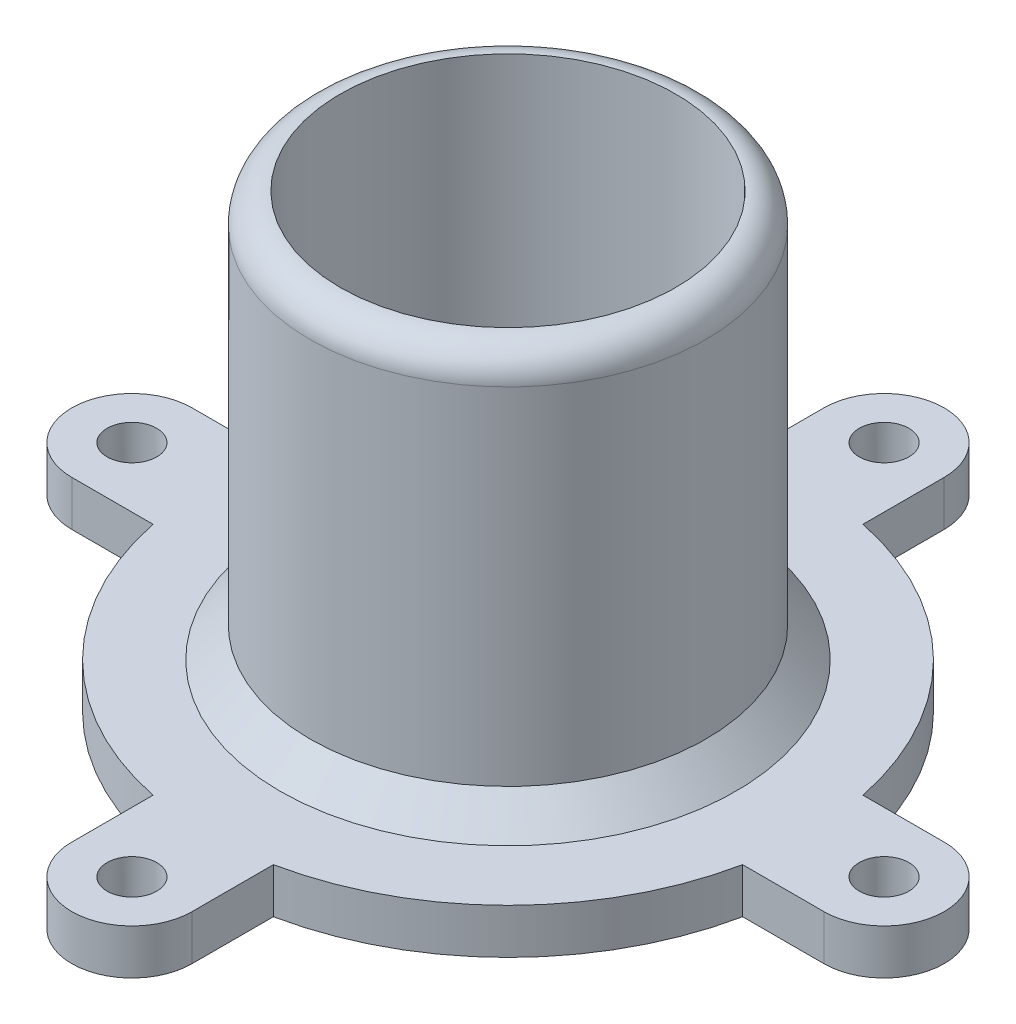
ISO-10303-21;
HEADER;
FILE_DESCRIPTION(('STEP AP214'),'2;1');
FILE_NAME('part.step','',(''),(''),'','','');
FILE_SCHEMA(('AUTOMOTIVE_DESIGN { 1 0 10303 214 1 1 1 1 }'));
ENDSEC;
DATA;
#1=APPLICATION_CONTEXT('core data for automotive mechanical design processes');
#2=APPLICATION_PROTOCOL_DEFINITION('international standard','automotive_design',2000,#1);
#3=PRODUCT_CONTEXT('',#1,'mechanical');
#4=PRODUCT('Part','Part','',(#3));
#5=PRODUCT_RELATED_PRODUCT_CATEGORY('part','',(#4));
#6=PRODUCT_DEFINITION_FORMATION('','',#4);
#7=PRODUCT_DEFINITION_CONTEXT('part definition',#1,'design');
#8=PRODUCT_DEFINITION('design','',#6,#7);
#9=PRODUCT_DEFINITION_SHAPE('','',#8);
#10=(LENGTH_UNIT() NAMED_UNIT(*) SI_UNIT(.MILLI.,.METRE.));
#11=(NAMED_UNIT(*) PLANE_ANGLE_UNIT() SI_UNIT($,.RADIAN.));
#12=(NAMED_UNIT(*) SI_UNIT($,.STERADIAN.) SOLID_ANGLE_UNIT());
#13=UNCERTAINTY_MEASURE_WITH_UNIT(LENGTH_MEASURE(1.E-05),#10,'distance_accuracy_value','');
#14=(GEOMETRIC_REPRESENTATION_CONTEXT(3) GLOBAL_UNCERTAINTY_ASSIGNED_CONTEXT((#13)) GLOBAL_UNIT_ASSIGNED_CONTEXT((#10,
#11,#12)) REPRESENTATION_CONTEXT('',''));
#15=CARTESIAN_POINT('',(0.,0.,0.));
#16=DIRECTION('',(0.,0.,1.));
#17=DIRECTION('',(1.,0.,0.));
#18=AXIS2_PLACEMENT_3D('',#15,#16,#17);
#19=CARTESIAN_POINT('',(0.,3.,0.));
#20=DIRECTION('',(0.,-1.,0.));
#21=DIRECTION('',(0.,0.,-1.));
#22=AXIS2_PLACEMENT_3D('',#19,#20,#21);
#23=CYLINDRICAL_SURFACE('',#22,20.);
#24=DIRECTION('',(0.,1.,0.));
#25=VECTOR('',#24,1.);
#26=CARTESIAN_POINT('',(4.00000000000021,-12.346528230584,19.5959179422654));
#27=LINE('',#26,#25);
#28=CARTESIAN_POINT('',(4.00000000000021,0.,19.5959179422654));
#29=VERTEX_POINT('',#28);
#30=CARTESIAN_POINT('',(4.00000000000021,3.,19.5959179422654));
#31=VERTEX_POINT('',#30);
#32=EDGE_CURVE('E164',#29,#31,#27,.T.);
#33=ORIENTED_EDGE('',*,*,#32,.F.);
#34=CARTESIAN_POINT('',(0.,0.,0.));
#35=DIRECTION('',(0.,1.,0.));
#36=DIRECTION('',(0.,0.,1.));
#37=AXIS2_PLACEMENT_3D('',#34,#35,#36);
#38=CIRCLE('',#37,20.);
#39=CARTESIAN_POINT('',(19.5959179422654,0.,4.));
#40=VERTEX_POINT('',#39);
#41=EDGE_CURVE('E151',#29,#40,#38,.T.);
#42=ORIENTED_EDGE('',*,*,#41,.T.);
#43=DIRECTION('',(0.,1.,0.));
#44=VECTOR('',#43,1.);
#45=CARTESIAN_POINT('',(19.5959179422654,-12.3465282305839,4.));
#46=LINE('',#45,#44);
#47=CARTESIAN_POINT('',(19.5959179422654,3.,4.));
#48=VERTEX_POINT('',#47);
#49=EDGE_CURVE('E265',#40,#48,#46,.T.);
#50=ORIENTED_EDGE('',*,*,#49,.T.);
#51=CARTESIAN_POINT('',(0.,3.,0.));
#52=DIRECTION('',(0.,1.,0.));
#53=DIRECTION('',(0.,0.,1.));
#54=AXIS2_PLACEMENT_3D('',#51,#52,#53);
#55=CIRCLE('',#54,20.);
#56=EDGE_CURVE('E53',#31,#48,#55,.T.);
#57=ORIENTED_EDGE('',*,*,#56,.F.);
#58=EDGE_LOOP('',(#33,#42,#50,#57));
#59=FACE_BOUND('',#58,.T.);
#60=ADVANCED_FACE('F38',(#59),#23,.T.);
#61=CARTESIAN_POINT('',(-19.5959179422654,0.,4.));
#62=VERTEX_POINT('',#61);
#63=CARTESIAN_POINT('',(-3.99999999999979,0.,19.5959179422655));
#64=VERTEX_POINT('',#63);
#65=EDGE_CURVE('E160',#62,#64,#38,.T.);
#66=ORIENTED_EDGE('',*,*,#65,.T.);
#67=DIRECTION('',(0.,1.,0.));
#68=VECTOR('',#67,1.);
#69=CARTESIAN_POINT('',(-3.99999999999979,-12.346528230584,19.5959179422655));
#70=LINE('',#69,#68);
#71=CARTESIAN_POINT('',(-3.99999999999979,3.,19.5959179422655));
#72=VERTEX_POINT('',#71);
#73=EDGE_CURVE('E61',#64,#72,#70,.T.);
#74=ORIENTED_EDGE('',*,*,#73,.T.);
#75=CARTESIAN_POINT('',(-19.5959179422654,3.,4.));
#76=VERTEX_POINT('',#75);
#77=EDGE_CURVE('E356',#76,#72,#55,.T.);
#78=ORIENTED_EDGE('',*,*,#77,.F.);
#79=DIRECTION('',(0.,1.,0.));
#80=VECTOR('',#79,1.);
#81=CARTESIAN_POINT('',(-19.5959179422654,-12.3465282305839,4.));
#82=LINE('',#81,#80);
#83=EDGE_CURVE('E184',#62,#76,#82,.T.);
#84=ORIENTED_EDGE('',*,*,#83,.F.);
#85=EDGE_LOOP('',(#66,#74,#78,#84));
#86=FACE_BOUND('',#85,.T.);
#87=ADVANCED_FACE('F318',(#86),#23,.T.);
#88=CARTESIAN_POINT('',(-4.00000000000007,0.,-19.5959179422654));
#89=VERTEX_POINT('',#88);
#90=CARTESIAN_POINT('',(-19.5959179422654,0.,-4.));
#91=VERTEX_POINT('',#90);
#92=EDGE_CURVE('E282',#89,#91,#38,.T.);
#93=ORIENTED_EDGE('',*,*,#92,.T.);
#94=DIRECTION('',(0.,1.,0.));
#95=VECTOR('',#94,1.);
#96=CARTESIAN_POINT('',(-19.5959179422654,-12.3465282305839,-4.));
#97=LINE('',#96,#95);
#98=CARTESIAN_POINT('',(-19.5959179422654,3.,-4.));
#99=VERTEX_POINT('',#98);
#100=EDGE_CURVE('E201',#91,#99,#97,.T.);
#101=ORIENTED_EDGE('',*,*,#100,.T.);
#102=CARTESIAN_POINT('',(-4.00000000000007,3.,-19.5959179422654));
#103=VERTEX_POINT('',#102);
#104=EDGE_CURVE('E280',#103,#99,#55,.T.);
#105=ORIENTED_EDGE('',*,*,#104,.F.);
#106=DIRECTION('',(0.,1.,0.));
#107=VECTOR('',#106,1.);
#108=CARTESIAN_POINT('',(-4.00000000000007,-12.3465282305839,-19.5959179422654));
#109=LINE('',#108,#107);
#110=EDGE_CURVE('E218',#89,#103,#109,.T.);
#111=ORIENTED_EDGE('',*,*,#110,.F.);
#112=EDGE_LOOP('',(#93,#101,#105,#111));
#113=FACE_BOUND('',#112,.T.);
#114=ADVANCED_FACE('F324',(#113),#23,.T.);
#115=CARTESIAN_POINT('',(19.5959179422654,0.,-4.));
#116=VERTEX_POINT('',#115);
#117=CARTESIAN_POINT('',(3.99999999999993,0.,-19.5959179422654));
#118=VERTEX_POINT('',#117);
#119=EDGE_CURVE('E163',#116,#118,#38,.T.);
#120=ORIENTED_EDGE('',*,*,#119,.T.);
#121=DIRECTION('',(0.,1.,0.));
#122=VECTOR('',#121,1.);
#123=CARTESIAN_POINT('',(3.99999999999993,-12.3465282305839,-19.5959179422654));
#124=LINE('',#123,#122);
#125=CARTESIAN_POINT('',(3.99999999999993,3.,-19.5959179422654));
#126=VERTEX_POINT('',#125);
#127=EDGE_CURVE('E235',#118,#126,#124,.T.);
#128=ORIENTED_EDGE('',*,*,#127,.T.);
#129=CARTESIAN_POINT('',(19.5959179422654,3.,-4.));
#130=VERTEX_POINT('',#129);
#131=EDGE_CURVE('E277',#130,#126,#55,.T.);
#132=ORIENTED_EDGE('',*,*,#131,.F.);
#133=DIRECTION('',(0.,1.,0.));
#134=VECTOR('',#133,1.);
#135=CARTESIAN_POINT('',(19.5959179422654,-12.3465282305839,-4.));
#136=LINE('',#135,#134);
#137=EDGE_CURVE('E250',#116,#130,#136,.T.);
#138=ORIENTED_EDGE('',*,*,#137,.F.);
#139=EDGE_LOOP('',(#120,#128,#132,#138));
#140=FACE_BOUND('',#139,.T.);
#141=ADVANCED_FACE('F320',(#140),#23,.T.);
#142=CARTESIAN_POINT('',(0.,3.,0.));
#143=DIRECTION('',(0.,1.,0.));
#144=DIRECTION('',(0.,0.,1.));
#145=AXIS2_PLACEMENT_3D('',#142,#143,#144);
#146=PLANE('',#145);
#147=CARTESIAN_POINT('',(0.,3.,0.));
#148=DIRECTION('',(0.,1.,0.));
#149=DIRECTION('',(0.,0.,1.));
#150=AXIS2_PLACEMENT_3D('',#147,#148,#149);
#151=CIRCLE('',#150,15.15);
#152=CARTESIAN_POINT('',(0.,3.,15.15));
#153=VERTEX_POINT('',#152);
#154=EDGE_CURVE('E46',#153,#153,#151,.F.);
#155=ORIENTED_EDGE('',*,*,#154,.T.);
#156=EDGE_LOOP('',(#155));
#157=FACE_BOUND('',#156,.T.);
#158=ORIENTED_EDGE('',*,*,#131,.T.);
#159=DIRECTION('',(0.,0.,-1.));
#160=VECTOR('',#159,1.);
#161=CARTESIAN_POINT('',(4.,3.,0.));
#162=LINE('',#161,#160);
#163=CARTESIAN_POINT('',(3.99999999999991,3.,-25.));
#164=VERTEX_POINT('',#163);
#165=EDGE_CURVE('E223',#126,#164,#162,.T.);
#166=ORIENTED_EDGE('',*,*,#165,.T.);
#167=CARTESIAN_POINT('',(0.,3.,-25.));
#168=DIRECTION('',(0.,1.,0.));
#169=DIRECTION('',(1.,0.,0.));
#170=AXIS2_PLACEMENT_3D('',#167,#168,#169);
#171=CIRCLE('',#170,4.);
#172=CARTESIAN_POINT('',(-4.00000000000009,3.,-25.));
#173=VERTEX_POINT('',#172);
#174=EDGE_CURVE('E219',#164,#173,#171,.T.);
#175=ORIENTED_EDGE('',*,*,#174,.T.);
#176=DIRECTION('',(0.,0.,-1.));
#177=VECTOR('',#176,1.);
#178=CARTESIAN_POINT('',(-4.,3.,0.));
#179=LINE('',#178,#177);
#180=EDGE_CURVE('E214',#103,#173,#179,.T.);
#181=ORIENTED_EDGE('',*,*,#180,.F.);
#182=ORIENTED_EDGE('',*,*,#104,.T.);
#183=DIRECTION('',(-1.,0.,0.));
#184=VECTOR('',#183,1.);
#185=CARTESIAN_POINT('',(0.,3.,-4.));
#186=LINE('',#185,#184);
#187=CARTESIAN_POINT('',(-25.,3.,-4.));
#188=VERTEX_POINT('',#187);
#189=EDGE_CURVE('E189',#99,#188,#186,.T.);
#190=ORIENTED_EDGE('',*,*,#189,.T.);
#191=CARTESIAN_POINT('',(-25.,3.,0.));
#192=DIRECTION('',(0.,1.,0.));
#193=DIRECTION('',(0.,0.,-1.));
#194=AXIS2_PLACEMENT_3D('',#191,#192,#193);
#195=CIRCLE('',#194,4.);
#196=CARTESIAN_POINT('',(-25.,3.,4.));
#197=VERTEX_POINT('',#196);
#198=EDGE_CURVE('E185',#188,#197,#195,.T.);
#199=ORIENTED_EDGE('',*,*,#198,.T.);
#200=DIRECTION('',(-1.,0.,0.));
#201=VECTOR('',#200,1.);
#202=CARTESIAN_POINT('',(0.,3.,4.));
#203=LINE('',#202,#201);
#204=EDGE_CURVE('E180',#76,#197,#203,.T.);
#205=ORIENTED_EDGE('',*,*,#204,.F.);
#206=ORIENTED_EDGE('',*,*,#77,.T.);
#207=DIRECTION('',(0.,0.,1.));
#208=VECTOR('',#207,1.);
#209=CARTESIAN_POINT('',(-4.,3.,0.));
#210=LINE('',#209,#208);
#211=CARTESIAN_POINT('',(-3.99999999999974,3.,25.));
#212=VERTEX_POINT('',#211);
#213=EDGE_CURVE('E382',#72,#212,#210,.T.);
#214=ORIENTED_EDGE('',*,*,#213,.T.);
#215=CARTESIAN_POINT('',(2.61861100413235E-13,3.,25.));
#216=DIRECTION('',(0.,1.,0.));
#217=DIRECTION('',(-1.,0.,0.));
#218=AXIS2_PLACEMENT_3D('',#215,#216,#217);
#219=CIRCLE('',#218,4.);
#220=CARTESIAN_POINT('',(4.00000000000026,3.,25.));
#221=VERTEX_POINT('',#220);
#222=EDGE_CURVE('E380',#212,#221,#219,.T.);
#223=ORIENTED_EDGE('',*,*,#222,.T.);
#224=DIRECTION('',(0.,0.,1.));
#225=VECTOR('',#224,1.);
#226=CARTESIAN_POINT('',(4.,3.,0.));
#227=LINE('',#226,#225);
#228=EDGE_CURVE('E168',#31,#221,#227,.T.);
#229=ORIENTED_EDGE('',*,*,#228,.F.);
#230=ORIENTED_EDGE('',*,*,#56,.T.);
#231=DIRECTION('',(1.,0.,0.));
#232=VECTOR('',#231,1.);
#233=CARTESIAN_POINT('',(0.,3.,4.));
#234=LINE('',#233,#232);
#235=CARTESIAN_POINT('',(25.,3.,4.));
#236=VERTEX_POINT('',#235);
#237=EDGE_CURVE('E254',#48,#236,#234,.T.);
#238=ORIENTED_EDGE('',*,*,#237,.T.);
#239=CARTESIAN_POINT('',(25.,3.,0.));
#240=DIRECTION('',(0.,1.,0.));
#241=DIRECTION('',(0.,0.,1.));
#242=AXIS2_PLACEMENT_3D('',#239,#240,#241);
#243=CIRCLE('',#242,4.);
#244=CARTESIAN_POINT('',(25.,3.,-4.));
#245=VERTEX_POINT('',#244);
#246=EDGE_CURVE('E251',#236,#245,#243,.T.);
#247=ORIENTED_EDGE('',*,*,#246,.T.);
#248=DIRECTION('',(1.,0.,0.));
#249=VECTOR('',#248,1.);
#250=CARTESIAN_POINT('',(0.,3.,-4.));
#251=LINE('',#250,#249);
#252=EDGE_CURVE('E246',#130,#245,#251,.T.);
#253=ORIENTED_EDGE('',*,*,#252,.F.);
#254=EDGE_LOOP('',(#158,#166,#175,#181,#182,#190,#199,#205,#206,#214,#223,#229,#230,#238,#247,#253));
#255=FACE_BOUND('',#254,.T.);
#256=CARTESIAN_POINT('',(25.,3.,0.));
#257=DIRECTION('',(0.,1.,0.));
#258=DIRECTION('',(0.,0.,1.));
#259=AXIS2_PLACEMENT_3D('',#256,#257,#258);
#260=CIRCLE('',#259,1.65);
#261=CARTESIAN_POINT('',(25.,3.,1.65));
#262=VERTEX_POINT('',#261);
#263=EDGE_CURVE('E258',#262,#262,#260,.T.);
#264=ORIENTED_EDGE('',*,*,#263,.F.);
#265=EDGE_LOOP('',(#264));
#266=FACE_BOUND('',#265,.T.);
#267=CARTESIAN_POINT('',(0.,3.,-25.));
#268=DIRECTION('',(0.,1.,0.));
#269=DIRECTION('',(1.,0.,0.));
#270=AXIS2_PLACEMENT_3D('',#267,#268,#269);
#271=CIRCLE('',#270,1.65);
#272=CARTESIAN_POINT('',(1.64999999999991,3.,-25.));
#273=VERTEX_POINT('',#272);
#274=EDGE_CURVE('E227',#273,#273,#271,.T.);
#275=ORIENTED_EDGE('',*,*,#274,.F.);
#276=EDGE_LOOP('',(#275));
#277=FACE_BOUND('',#276,.T.);
#278=CARTESIAN_POINT('',(-25.,3.,0.));
#279=DIRECTION('',(0.,1.,0.));
#280=DIRECTION('',(0.,0.,-1.));
#281=AXIS2_PLACEMENT_3D('',#278,#279,#280);
#282=CIRCLE('',#281,1.65);
#283=CARTESIAN_POINT('',(-25.,3.,-1.65));
#284=VERTEX_POINT('',#283);
#285=EDGE_CURVE('E193',#284,#284,#282,.T.);
#286=ORIENTED_EDGE('',*,*,#285,.F.);
#287=EDGE_LOOP('',(#286));
#288=FACE_BOUND('',#287,.T.);
#289=CARTESIAN_POINT('',(2.61861100413235E-13,3.,25.));
#290=DIRECTION('',(0.,1.,0.));
#291=DIRECTION('',(-1.,0.,0.));
#292=AXIS2_PLACEMENT_3D('',#289,#290,#291);
#293=CIRCLE('',#292,1.65);
#294=CARTESIAN_POINT('',(-1.64999999999974,3.,25.));
#295=VERTEX_POINT('',#294);
#296=EDGE_CURVE('E386',#295,#295,#293,.T.);
#297=ORIENTED_EDGE('',*,*,#296,.F.);
#298=EDGE_LOOP('',(#297));
#299=FACE_BOUND('',#298,.T.);
#300=ADVANCED_FACE('F293',(#157,#255,#266,#277,#288,#299),#146,.T.);
#301=CARTESIAN_POINT('',(0.,0.,0.));
#302=DIRECTION('',(0.,1.,0.));
#303=DIRECTION('',(0.,0.,1.));
#304=AXIS2_PLACEMENT_3D('',#301,#302,#303);
#305=PLANE('',#304);
#306=CARTESIAN_POINT('',(0.,0.,0.));
#307=DIRECTION('',(0.,1.,0.));
#308=DIRECTION('',(0.,0.,1.));
#309=AXIS2_PLACEMENT_3D('',#306,#307,#308);
#310=CIRCLE('',#309,13.15);
#311=CARTESIAN_POINT('',(0.,0.,13.15));
#312=VERTEX_POINT('',#311);
#313=EDGE_CURVE('E279',#312,#312,#310,.T.);
#314=ORIENTED_EDGE('',*,*,#313,.T.);
#315=EDGE_LOOP('',(#314));
#316=FACE_BOUND('',#315,.T.);
#317=ORIENTED_EDGE('',*,*,#119,.F.);
#318=DIRECTION('',(-1.,0.,0.));
#319=VECTOR('',#318,1.);
#320=CARTESIAN_POINT('',(0.,0.,-4.));
#321=LINE('',#320,#319);
#322=CARTESIAN_POINT('',(25.,0.,-4.));
#323=VERTEX_POINT('',#322);
#324=EDGE_CURVE('E267',#323,#116,#321,.T.);
#325=ORIENTED_EDGE('',*,*,#324,.F.);
#326=CARTESIAN_POINT('',(25.,0.,0.));
#327=DIRECTION('',(0.,1.,0.));
#328=DIRECTION('',(0.,0.,1.));
#329=AXIS2_PLACEMENT_3D('',#326,#327,#328);
#330=CIRCLE('',#329,4.);
#331=CARTESIAN_POINT('',(25.,0.,4.));
#332=VERTEX_POINT('',#331);
#333=EDGE_CURVE('E263',#323,#332,#330,.F.);
#334=ORIENTED_EDGE('',*,*,#333,.T.);
#335=DIRECTION('',(-1.,0.,0.));
#336=VECTOR('',#335,1.);
#337=CARTESIAN_POINT('',(0.,0.,4.));
#338=LINE('',#337,#336);
#339=EDGE_CURVE('E158',#332,#40,#338,.T.);
#340=ORIENTED_EDGE('',*,*,#339,.T.);
#341=ORIENTED_EDGE('',*,*,#41,.F.);
#342=DIRECTION('',(0.,0.,-1.));
#343=VECTOR('',#342,1.);
#344=CARTESIAN_POINT('',(4.,0.,0.));
#345=LINE('',#344,#343);
#346=CARTESIAN_POINT('',(4.00000000000026,0.,25.));
#347=VERTEX_POINT('',#346);
#348=EDGE_CURVE('E155',#347,#29,#345,.T.);
#349=ORIENTED_EDGE('',*,*,#348,.F.);
#350=CARTESIAN_POINT('',(2.61861100413235E-13,0.,25.));
#351=DIRECTION('',(0.,1.,0.));
#352=DIRECTION('',(0.,0.,1.));
#353=AXIS2_PLACEMENT_3D('',#350,#351,#352);
#354=CIRCLE('',#353,4.);
#355=CARTESIAN_POINT('',(-3.99999999999974,0.,25.));
#356=VERTEX_POINT('',#355);
#357=EDGE_CURVE('E209',#347,#356,#354,.F.);
#358=ORIENTED_EDGE('',*,*,#357,.T.);
#359=DIRECTION('',(0.,0.,-1.));
#360=VECTOR('',#359,1.);
#361=CARTESIAN_POINT('',(-4.,0.,0.));
#362=LINE('',#361,#360);
#363=EDGE_CURVE('E178',#356,#64,#362,.T.);
#364=ORIENTED_EDGE('',*,*,#363,.T.);
#365=ORIENTED_EDGE('',*,*,#65,.F.);
#366=DIRECTION('',(1.,0.,0.));
#367=VECTOR('',#366,1.);
#368=CARTESIAN_POINT('',(0.,0.,4.));
#369=LINE('',#368,#367);
#370=CARTESIAN_POINT('',(-25.,0.,4.));
#371=VERTEX_POINT('',#370);
#372=EDGE_CURVE('E203',#371,#62,#369,.T.);
#373=ORIENTED_EDGE('',*,*,#372,.F.);
#374=CARTESIAN_POINT('',(-25.,0.,0.));
#375=DIRECTION('',(0.,1.,0.));
#376=DIRECTION('',(0.,0.,1.));
#377=AXIS2_PLACEMENT_3D('',#374,#375,#376);
#378=CIRCLE('',#377,4.);
#379=CARTESIAN_POINT('',(-25.,0.,-4.));
#380=VERTEX_POINT('',#379);
#381=EDGE_CURVE('E198',#371,#380,#378,.F.);
#382=ORIENTED_EDGE('',*,*,#381,.T.);
#383=DIRECTION('',(1.,0.,0.));
#384=VECTOR('',#383,1.);
#385=CARTESIAN_POINT('',(0.,0.,-4.));
#386=LINE('',#385,#384);
#387=EDGE_CURVE('E188',#380,#91,#386,.T.);
#388=ORIENTED_EDGE('',*,*,#387,.T.);
#389=ORIENTED_EDGE('',*,*,#92,.F.);
#390=DIRECTION('',(0.,0.,1.));
#391=VECTOR('',#390,1.);
#392=CARTESIAN_POINT('',(-4.,0.,0.));
#393=LINE('',#392,#391);
#394=CARTESIAN_POINT('',(-4.00000000000009,0.,-25.));
#395=VERTEX_POINT('',#394);
#396=EDGE_CURVE('E237',#395,#89,#393,.T.);
#397=ORIENTED_EDGE('',*,*,#396,.F.);
#398=CARTESIAN_POINT('',(0.,0.,-25.));
#399=DIRECTION('',(0.,1.,0.));
#400=DIRECTION('',(0.,0.,1.));
#401=AXIS2_PLACEMENT_3D('',#398,#399,#400);
#402=CIRCLE('',#401,4.);
#403=CARTESIAN_POINT('',(3.99999999999991,0.,-25.));
#404=VERTEX_POINT('',#403);
#405=EDGE_CURVE('E232',#395,#404,#402,.F.);
#406=ORIENTED_EDGE('',*,*,#405,.T.);
#407=DIRECTION('',(0.,0.,1.));
#408=VECTOR('',#407,1.);
#409=CARTESIAN_POINT('',(4.,0.,0.));
#410=LINE('',#409,#408);
#411=EDGE_CURVE('E222',#404,#118,#410,.T.);
#412=ORIENTED_EDGE('',*,*,#411,.T.);
#413=EDGE_LOOP('',(#317,#325,#334,#340,#341,#349,#358,#364,#365,#373,#382,#388,#389,#397,#406,#412));
#414=FACE_BOUND('',#413,.T.);
#415=CARTESIAN_POINT('',(25.,0.,0.));
#416=DIRECTION('',(0.,1.,0.));
#417=DIRECTION('',(0.,0.,1.));
#418=AXIS2_PLACEMENT_3D('',#415,#416,#417);
#419=CIRCLE('',#418,1.65);
#420=CARTESIAN_POINT('',(25.,0.,1.65));
#421=VERTEX_POINT('',#420);
#422=EDGE_CURVE('E249',#421,#421,#419,.F.);
#423=ORIENTED_EDGE('',*,*,#422,.F.);
#424=EDGE_LOOP('',(#423));
#425=FACE_BOUND('',#424,.T.);
#426=CARTESIAN_POINT('',(0.,0.,-25.));
#427=DIRECTION('',(0.,1.,0.));
#428=DIRECTION('',(0.,0.,1.));
#429=AXIS2_PLACEMENT_3D('',#426,#427,#428);
#430=CIRCLE('',#429,1.65);
#431=CARTESIAN_POINT('',(0.,0.,-23.35));
#432=VERTEX_POINT('',#431);
#433=EDGE_CURVE('E217',#432,#432,#430,.F.);
#434=ORIENTED_EDGE('',*,*,#433,.F.);
#435=EDGE_LOOP('',(#434));
#436=FACE_BOUND('',#435,.T.);
#437=CARTESIAN_POINT('',(-25.,0.,0.));
#438=DIRECTION('',(0.,1.,0.));
#439=DIRECTION('',(0.,0.,1.));
#440=AXIS2_PLACEMENT_3D('',#437,#438,#439);
#441=CIRCLE('',#440,1.65);
#442=CARTESIAN_POINT('',(-25.,0.,1.65));
#443=VERTEX_POINT('',#442);
#444=EDGE_CURVE('E183',#443,#443,#441,.F.);
#445=ORIENTED_EDGE('',*,*,#444,.F.);
#446=EDGE_LOOP('',(#445));
#447=FACE_BOUND('',#446,.T.);
#448=CARTESIAN_POINT('',(2.61861100413235E-13,0.,25.));
#449=DIRECTION('',(0.,1.,0.));
#450=DIRECTION('',(0.,0.,1.));
#451=AXIS2_PLACEMENT_3D('',#448,#449,#450);
#452=CIRCLE('',#451,1.65);
#453=CARTESIAN_POINT('',(2.61861100413235E-13,0.,26.65));
#454=VERTEX_POINT('',#453);
#455=EDGE_CURVE('E392',#454,#454,#452,.F.);
#456=ORIENTED_EDGE('',*,*,#455,.F.);
#457=EDGE_LOOP('',(#456));
#458=FACE_BOUND('',#457,.T.);
#459=ADVANCED_FACE('F152',(#316,#414,#425,#436,#447,#458),#305,.F.);
#460=CARTESIAN_POINT('',(0.,30.,0.));
#461=DIRECTION('',(0.,-1.,0.));
#462=DIRECTION('',(0.,0.,-1.));
#463=AXIS2_PLACEMENT_3D('',#460,#461,#462);
#464=CYLINDRICAL_SURFACE('',#463,11.15);
#465=CARTESIAN_POINT('',(0.,2.00000000000001,0.));
#466=DIRECTION('',(0.,1.,0.));
#467=DIRECTION('',(0.,0.,1.));
#468=AXIS2_PLACEMENT_3D('',#465,#466,#467);
#469=CIRCLE('',#468,11.15);
#470=CARTESIAN_POINT('',(0.,2.00000000000001,11.15));
#471=VERTEX_POINT('',#470);
#472=EDGE_CURVE('E285',#471,#471,#469,.F.);
#473=ORIENTED_EDGE('',*,*,#472,.T.);
#474=EDGE_LOOP('',(#473));
#475=FACE_BOUND('',#474,.T.);
#476=CARTESIAN_POINT('',(0.,30.,0.));
#477=DIRECTION('',(0.,1.,0.));
#478=DIRECTION('',(0.,0.,1.));
#479=AXIS2_PLACEMENT_3D('',#476,#477,#478);
#480=CIRCLE('',#479,11.15);
#481=CARTESIAN_POINT('',(0.,30.,11.15));
#482=VERTEX_POINT('',#481);
#483=EDGE_CURVE('E161',#482,#482,#480,.T.);
#484=ORIENTED_EDGE('',*,*,#483,.T.);
#485=EDGE_LOOP('',(#484));
#486=FACE_BOUND('',#485,.T.);
#487=ADVANCED_FACE('F305',(#475,#486),#464,.F.);
#488=CARTESIAN_POINT('',(0.,30.,0.));
#489=DIRECTION('',(0.,-1.,0.));
#490=DIRECTION('',(0.,0.,-1.));
#491=AXIS2_PLACEMENT_3D('',#488,#489,#490);
#492=CYLINDRICAL_SURFACE('',#491,13.15);
#493=CARTESIAN_POINT('',(0.,28.,0.));
#494=DIRECTION('',(0.,1.,0.));
#495=DIRECTION('',(0.,0.,1.));
#496=AXIS2_PLACEMENT_3D('',#493,#494,#495);
#497=CIRCLE('',#496,13.15);
#498=CARTESIAN_POINT('',(0.,28.,13.15));
#499=VERTEX_POINT('',#498);
#500=EDGE_CURVE('E11',#499,#499,#497,.F.);
#501=ORIENTED_EDGE('',*,*,#500,.T.);
#502=EDGE_LOOP('',(#501));
#503=FACE_BOUND('',#502,.T.);
#504=CARTESIAN_POINT('',(0.,5.,0.));
#505=DIRECTION('',(0.,1.,0.));
#506=DIRECTION('',(0.,0.,1.));
#507=AXIS2_PLACEMENT_3D('',#504,#505,#506);
#508=CIRCLE('',#507,13.15);
#509=CARTESIAN_POINT('',(0.,5.,13.15));
#510=VERTEX_POINT('',#509);
#511=EDGE_CURVE('E288',#510,#510,#508,.T.);
#512=ORIENTED_EDGE('',*,*,#511,.T.);
#513=EDGE_LOOP('',(#512));
#514=FACE_BOUND('',#513,.T.);
#515=ADVANCED_FACE('F302',(#503,#514),#492,.T.);
#516=CARTESIAN_POINT('',(0.,-12.3465282305839,4.));
#517=DIRECTION('',(0.,0.,1.));
#518=DIRECTION('',(1.,0.,0.));
#519=AXIS2_PLACEMENT_3D('',#516,#517,#518);
#520=PLANE('',#519);
#521=ORIENTED_EDGE('',*,*,#339,.F.);
#522=DIRECTION('',(0.,1.,0.));
#523=VECTOR('',#522,1.);
#524=CARTESIAN_POINT('',(25.,-12.3465282305839,4.));
#525=LINE('',#524,#523);
#526=EDGE_CURVE('E234',#332,#236,#525,.T.);
#527=ORIENTED_EDGE('',*,*,#526,.T.);
#528=ORIENTED_EDGE('',*,*,#237,.F.);
#529=ORIENTED_EDGE('',*,*,#49,.F.);
#530=EDGE_LOOP('',(#521,#527,#528,#529));
#531=FACE_BOUND('',#530,.T.);
#532=ADVANCED_FACE('F304',(#531),#520,.T.);
#533=CARTESIAN_POINT('',(0.,-12.3465282305839,-4.));
#534=DIRECTION('',(0.,0.,1.));
#535=DIRECTION('',(1.,0.,0.));
#536=AXIS2_PLACEMENT_3D('',#533,#534,#535);
#537=PLANE('',#536);
#538=DIRECTION('',(0.,1.,0.));
#539=VECTOR('',#538,1.);
#540=CARTESIAN_POINT('',(25.,-12.3465282305839,-4.));
#541=LINE('',#540,#539);
#542=EDGE_CURVE('E257',#323,#245,#541,.T.);
#543=ORIENTED_EDGE('',*,*,#542,.F.);
#544=ORIENTED_EDGE('',*,*,#324,.T.);
#545=ORIENTED_EDGE('',*,*,#137,.T.);
#546=ORIENTED_EDGE('',*,*,#252,.T.);
#547=EDGE_LOOP('',(#543,#544,#545,#546));
#548=FACE_BOUND('',#547,.T.);
#549=ADVANCED_FACE('F312',(#548),#537,.F.);
#550=CARTESIAN_POINT('',(25.,-12.3465282305839,0.));
#551=DIRECTION('',(0.,1.,0.));
#552=DIRECTION('',(0.,0.,1.));
#553=AXIS2_PLACEMENT_3D('',#550,#551,#552);
#554=CYLINDRICAL_SURFACE('',#553,1.65);
#555=ORIENTED_EDGE('',*,*,#422,.T.);
#556=EDGE_LOOP('',(#555));
#557=FACE_BOUND('',#556,.T.);
#558=ORIENTED_EDGE('',*,*,#263,.T.);
#559=EDGE_LOOP('',(#558));
#560=FACE_BOUND('',#559,.T.);
#561=ADVANCED_FACE('F437',(#557,#560),#554,.F.);
#562=CARTESIAN_POINT('',(25.,-12.3465282305839,0.));
#563=DIRECTION('',(0.,1.,0.));
#564=DIRECTION('',(0.,0.,1.));
#565=AXIS2_PLACEMENT_3D('',#562,#563,#564);
#566=CYLINDRICAL_SURFACE('',#565,4.);
#567=ORIENTED_EDGE('',*,*,#333,.F.);
#568=ORIENTED_EDGE('',*,*,#542,.T.);
#569=ORIENTED_EDGE('',*,*,#246,.F.);
#570=ORIENTED_EDGE('',*,*,#526,.F.);
#571=EDGE_LOOP('',(#567,#568,#569,#570));
#572=FACE_BOUND('',#571,.T.);
#573=ADVANCED_FACE('F354',(#572),#566,.T.);
#574=CARTESIAN_POINT('',(4.,-12.3465282305839,0.));
#575=DIRECTION('',(1.,0.,0.));
#576=DIRECTION('',(0.,0.,-1.));
#577=AXIS2_PLACEMENT_3D('',#574,#575,#576);
#578=PLANE('',#577);
#579=ORIENTED_EDGE('',*,*,#411,.F.);
#580=DIRECTION('',(0.,1.,0.));
#581=VECTOR('',#580,1.);
#582=CARTESIAN_POINT('',(3.99999999999991,-12.3465282305839,-25.));
#583=LINE('',#582,#581);
#584=EDGE_CURVE('E200',#404,#164,#583,.T.);
#585=ORIENTED_EDGE('',*,*,#584,.T.);
#586=ORIENTED_EDGE('',*,*,#165,.F.);
#587=ORIENTED_EDGE('',*,*,#127,.F.);
#588=EDGE_LOOP('',(#579,#585,#586,#587));
#589=FACE_BOUND('',#588,.T.);
#590=ADVANCED_FACE('F342',(#589),#578,.T.);
#591=CARTESIAN_POINT('',(-4.,-12.3465282305839,0.));
#592=DIRECTION('',(1.,0.,0.));
#593=DIRECTION('',(0.,0.,-1.));
#594=AXIS2_PLACEMENT_3D('',#591,#592,#593);
#595=PLANE('',#594);
#596=DIRECTION('',(0.,1.,0.));
#597=VECTOR('',#596,1.);
#598=CARTESIAN_POINT('',(-4.00000000000009,-12.3465282305839,-25.));
#599=LINE('',#598,#597);
#600=EDGE_CURVE('E226',#395,#173,#599,.T.);
#601=ORIENTED_EDGE('',*,*,#600,.F.);
#602=ORIENTED_EDGE('',*,*,#396,.T.);
#603=ORIENTED_EDGE('',*,*,#110,.T.);
#604=ORIENTED_EDGE('',*,*,#180,.T.);
#605=EDGE_LOOP('',(#601,#602,#603,#604));
#606=FACE_BOUND('',#605,.T.);
#607=ADVANCED_FACE('F427',(#606),#595,.F.);
#608=CARTESIAN_POINT('',(0.,-12.3465282305839,-25.));
#609=DIRECTION('',(0.,1.,0.));
#610=DIRECTION('',(0.,0.,1.));
#611=AXIS2_PLACEMENT_3D('',#608,#609,#610);
#612=CYLINDRICAL_SURFACE('',#611,1.65);
#613=ORIENTED_EDGE('',*,*,#433,.T.);
#614=EDGE_LOOP('',(#613));
#615=FACE_BOUND('',#614,.T.);
#616=ORIENTED_EDGE('',*,*,#274,.T.);
#617=EDGE_LOOP('',(#616));
#618=FACE_BOUND('',#617,.T.);
#619=ADVANCED_FACE('F424',(#615,#618),#612,.F.);
#620=CARTESIAN_POINT('',(0.,-12.3465282305839,-25.));
#621=DIRECTION('',(0.,1.,0.));
#622=DIRECTION('',(0.,0.,1.));
#623=AXIS2_PLACEMENT_3D('',#620,#621,#622);
#624=CYLINDRICAL_SURFACE('',#623,4.);
#625=ORIENTED_EDGE('',*,*,#405,.F.);
#626=ORIENTED_EDGE('',*,*,#600,.T.);
#627=ORIENTED_EDGE('',*,*,#174,.F.);
#628=ORIENTED_EDGE('',*,*,#584,.F.);
#629=EDGE_LOOP('',(#625,#626,#627,#628));
#630=FACE_BOUND('',#629,.T.);
#631=ADVANCED_FACE('F423',(#630),#624,.T.);
#632=CARTESIAN_POINT('',(0.,-12.3465282305839,-4.));
#633=DIRECTION('',(0.,0.,-1.));
#634=DIRECTION('',(-1.,0.,0.));
#635=AXIS2_PLACEMENT_3D('',#632,#633,#634);
#636=PLANE('',#635);
#637=ORIENTED_EDGE('',*,*,#387,.F.);
#638=DIRECTION('',(0.,1.,0.));
#639=VECTOR('',#638,1.);
#640=CARTESIAN_POINT('',(-25.,-12.3465282305839,-4.));
#641=LINE('',#640,#639);
#642=EDGE_CURVE('E204',#380,#188,#641,.T.);
#643=ORIENTED_EDGE('',*,*,#642,.T.);
#644=ORIENTED_EDGE('',*,*,#189,.F.);
#645=ORIENTED_EDGE('',*,*,#100,.F.);
#646=EDGE_LOOP('',(#637,#643,#644,#645));
#647=FACE_BOUND('',#646,.T.);
#648=ADVANCED_FACE('F366',(#647),#636,.T.);
#649=CARTESIAN_POINT('',(0.,-12.3465282305839,4.));
#650=DIRECTION('',(0.,0.,-1.));
#651=DIRECTION('',(-1.,0.,0.));
#652=AXIS2_PLACEMENT_3D('',#649,#650,#651);
#653=PLANE('',#652);
#654=DIRECTION('',(0.,1.,0.));
#655=VECTOR('',#654,1.);
#656=CARTESIAN_POINT('',(-25.,-12.3465282305839,4.));
#657=LINE('',#656,#655);
#658=EDGE_CURVE('E192',#371,#197,#657,.T.);
#659=ORIENTED_EDGE('',*,*,#658,.F.);
#660=ORIENTED_EDGE('',*,*,#372,.T.);
#661=ORIENTED_EDGE('',*,*,#83,.T.);
#662=ORIENTED_EDGE('',*,*,#204,.T.);
#663=EDGE_LOOP('',(#659,#660,#661,#662));
#664=FACE_BOUND('',#663,.T.);
#665=ADVANCED_FACE('F374',(#664),#653,.F.);
#666=CARTESIAN_POINT('',(-25.,-12.3465282305839,0.));
#667=DIRECTION('',(0.,1.,0.));
#668=DIRECTION('',(0.,0.,1.));
#669=AXIS2_PLACEMENT_3D('',#666,#667,#668);
#670=CYLINDRICAL_SURFACE('',#669,1.65);
#671=ORIENTED_EDGE('',*,*,#444,.T.);
#672=EDGE_LOOP('',(#671));
#673=FACE_BOUND('',#672,.T.);
#674=ORIENTED_EDGE('',*,*,#285,.T.);
#675=EDGE_LOOP('',(#674));
#676=FACE_BOUND('',#675,.T.);
#677=ADVANCED_FACE('F413',(#673,#676),#670,.F.);
#678=CARTESIAN_POINT('',(-25.,-12.3465282305839,0.));
#679=DIRECTION('',(0.,1.,0.));
#680=DIRECTION('',(0.,0.,1.));
#681=AXIS2_PLACEMENT_3D('',#678,#679,#680);
#682=CYLINDRICAL_SURFACE('',#681,4.);
#683=ORIENTED_EDGE('',*,*,#381,.F.);
#684=ORIENTED_EDGE('',*,*,#658,.T.);
#685=ORIENTED_EDGE('',*,*,#198,.F.);
#686=ORIENTED_EDGE('',*,*,#642,.F.);
#687=EDGE_LOOP('',(#683,#684,#685,#686));
#688=FACE_BOUND('',#687,.T.);
#689=ADVANCED_FACE('F371',(#688),#682,.T.);
#690=CARTESIAN_POINT('',(-4.,-12.346528230584,0.));
#691=DIRECTION('',(-1.,0.,0.));
#692=DIRECTION('',(0.,0.,1.));
#693=AXIS2_PLACEMENT_3D('',#690,#691,#692);
#694=PLANE('',#693);
#695=ORIENTED_EDGE('',*,*,#363,.F.);
#696=DIRECTION('',(0.,1.,0.));
#697=VECTOR('',#696,1.);
#698=CARTESIAN_POINT('',(-3.99999999999974,-12.346528230584,25.));
#699=LINE('',#698,#697);
#700=EDGE_CURVE('E174',#356,#212,#699,.T.);
#701=ORIENTED_EDGE('',*,*,#700,.T.);
#702=ORIENTED_EDGE('',*,*,#213,.F.);
#703=ORIENTED_EDGE('',*,*,#73,.F.);
#704=EDGE_LOOP('',(#695,#701,#702,#703));
#705=FACE_BOUND('',#704,.T.);
#706=ADVANCED_FACE('F381',(#705),#694,.T.);
#707=CARTESIAN_POINT('',(4.,-12.346528230584,0.));
#708=DIRECTION('',(-1.,0.,0.));
#709=DIRECTION('',(0.,0.,1.));
#710=AXIS2_PLACEMENT_3D('',#707,#708,#709);
#711=PLANE('',#710);
#712=DIRECTION('',(0.,1.,0.));
#713=VECTOR('',#712,1.);
#714=CARTESIAN_POINT('',(4.00000000000026,-12.346528230584,25.));
#715=LINE('',#714,#713);
#716=EDGE_CURVE('E171',#347,#221,#715,.T.);
#717=ORIENTED_EDGE('',*,*,#716,.F.);
#718=ORIENTED_EDGE('',*,*,#348,.T.);
#719=ORIENTED_EDGE('',*,*,#32,.T.);
#720=ORIENTED_EDGE('',*,*,#228,.T.);
#721=EDGE_LOOP('',(#717,#718,#719,#720));
#722=FACE_BOUND('',#721,.T.);
#723=ADVANCED_FACE('F170',(#722),#711,.F.);
#724=CARTESIAN_POINT('',(2.61861100413235E-13,-12.346528230584,25.));
#725=DIRECTION('',(0.,1.,0.));
#726=DIRECTION('',(0.,0.,1.));
#727=AXIS2_PLACEMENT_3D('',#724,#725,#726);
#728=CYLINDRICAL_SURFACE('',#727,1.65);
#729=ORIENTED_EDGE('',*,*,#455,.T.);
#730=EDGE_LOOP('',(#729));
#731=FACE_BOUND('',#730,.T.);
#732=ORIENTED_EDGE('',*,*,#296,.T.);
#733=EDGE_LOOP('',(#732));
#734=FACE_BOUND('',#733,.T.);
#735=ADVANCED_FACE('F400',(#731,#734),#728,.F.);
#736=CARTESIAN_POINT('',(2.61861100413235E-13,-12.346528230584,25.));
#737=DIRECTION('',(0.,1.,0.));
#738=DIRECTION('',(0.,0.,1.));
#739=AXIS2_PLACEMENT_3D('',#736,#737,#738);
#740=CYLINDRICAL_SURFACE('',#739,4.);
#741=ORIENTED_EDGE('',*,*,#357,.F.);
#742=ORIENTED_EDGE('',*,*,#716,.T.);
#743=ORIENTED_EDGE('',*,*,#222,.F.);
#744=ORIENTED_EDGE('',*,*,#700,.F.);
#745=EDGE_LOOP('',(#741,#742,#743,#744));
#746=FACE_BOUND('',#745,.T.);
#747=ADVANCED_FACE('F398',(#746),#740,.T.);
#748=CARTESIAN_POINT('',(0.,0.,0.));
#749=DIRECTION('',(0.,-1.,0.));
#750=DIRECTION('',(0.,0.,-1.));
#751=AXIS2_PLACEMENT_3D('',#748,#749,#750);
#752=CONICAL_SURFACE('',#751,13.15,0.785398163397446);
#753=ORIENTED_EDGE('',*,*,#472,.F.);
#754=EDGE_LOOP('',(#753));
#755=FACE_BOUND('',#754,.T.);
#756=ORIENTED_EDGE('',*,*,#313,.F.);
#757=EDGE_LOOP('',(#756));
#758=FACE_BOUND('',#757,.T.);
#759=ADVANCED_FACE('F299',(#755,#758),#752,.F.);
#760=CARTESIAN_POINT('',(0.,5.,0.));
#761=DIRECTION('',(0.,-1.,0.));
#762=DIRECTION('',(0.,0.,-1.));
#763=AXIS2_PLACEMENT_3D('',#760,#761,#762);
#764=CONICAL_SURFACE('',#763,13.15,0.785398163397444);
#765=ORIENTED_EDGE('',*,*,#154,.F.);
#766=EDGE_LOOP('',(#765));
#767=FACE_BOUND('',#766,.T.);
#768=ORIENTED_EDGE('',*,*,#511,.F.);
#769=EDGE_LOOP('',(#768));
#770=FACE_BOUND('',#769,.T.);
#771=ADVANCED_FACE('F296',(#767,#770),#764,.T.);
#772=CARTESIAN_POINT('',(0.,28.,0.));
#773=DIRECTION('',(0.,1.,0.));
#774=DIRECTION('',(0.,0.,1.));
#775=AXIS2_PLACEMENT_3D('',#772,#773,#774);
#776=TOROIDAL_SURFACE('',#775,11.15,2.);
#777=ORIENTED_EDGE('',*,*,#500,.F.);
#778=EDGE_LOOP('',(#777));
#779=FACE_BOUND('',#778,.T.);
#780=ORIENTED_EDGE('',*,*,#483,.F.);
#781=EDGE_LOOP('',(#780));
#782=FACE_BOUND('',#781,.T.);
#783=ADVANCED_FACE('F40',(#779,#782),#776,.T.);
#784=CLOSED_SHELL('',(#60,#87,#114,#141,#300,#459,#487,#515,#532,#549,#561,#573,#590,#607,#619,
#631,#648,#665,#677,#689,#706,#723,#735,#747,#759,#771,#783));
#785=MANIFOLD_SOLID_BREP('B2',#784);
#786=ADVANCED_BREP_SHAPE_REPRESENTATION('',(#18,#785),#14);
#787=SHAPE_DEFINITION_REPRESENTATION(#9,#786);
ENDSEC;
END-ISO-10303-21;
